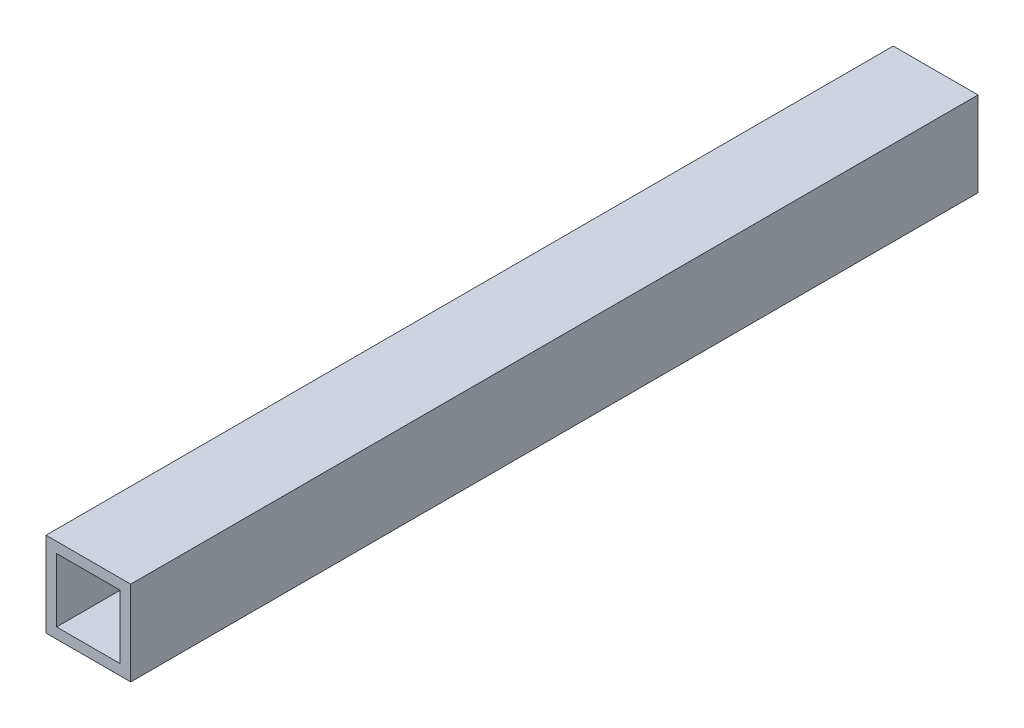
ISO-10303-21;
HEADER;
FILE_DESCRIPTION(('STEP AP214'),'2;1');
FILE_NAME('part.step','',(''),(''),'','','');
FILE_SCHEMA(('AUTOMOTIVE_DESIGN { 1 0 10303 214 1 1 1 1 }'));
ENDSEC;
DATA;
#1=APPLICATION_CONTEXT('core data for automotive mechanical design processes');
#2=APPLICATION_PROTOCOL_DEFINITION('international standard','automotive_design',2000,#1);
#3=PRODUCT_CONTEXT('',#1,'mechanical');
#4=PRODUCT('Part','Part','',(#3));
#5=PRODUCT_RELATED_PRODUCT_CATEGORY('part','',(#4));
#6=PRODUCT_DEFINITION_FORMATION('','',#4);
#7=PRODUCT_DEFINITION_CONTEXT('part definition',#1,'design');
#8=PRODUCT_DEFINITION('design','',#6,#7);
#9=PRODUCT_DEFINITION_SHAPE('','',#8);
#10=(LENGTH_UNIT() NAMED_UNIT(*) SI_UNIT(.MILLI.,.METRE.));
#11=(NAMED_UNIT(*) PLANE_ANGLE_UNIT() SI_UNIT($,.RADIAN.));
#12=(NAMED_UNIT(*) SI_UNIT($,.STERADIAN.) SOLID_ANGLE_UNIT());
#13=UNCERTAINTY_MEASURE_WITH_UNIT(LENGTH_MEASURE(1.E-05),#10,'distance_accuracy_value','');
#14=(GEOMETRIC_REPRESENTATION_CONTEXT(3) GLOBAL_UNCERTAINTY_ASSIGNED_CONTEXT((#13)) GLOBAL_UNIT_ASSIGNED_CONTEXT((#10,
#11,#12)) REPRESENTATION_CONTEXT('',''));
#15=CARTESIAN_POINT('',(0.,0.,0.));
#16=DIRECTION('',(0.,0.,1.));
#17=DIRECTION('',(1.,0.,0.));
#18=AXIS2_PLACEMENT_3D('',#15,#16,#17);
#19=CARTESIAN_POINT('',(0.,0.,254.));
#20=DIRECTION('',(0.,0.,1.));
#21=DIRECTION('',(1.,0.,0.));
#22=AXIS2_PLACEMENT_3D('',#19,#20,#21);
#23=PLANE('',#22);
#24=DIRECTION('',(0.,-1.,0.));
#25=VECTOR('',#24,1.);
#26=CARTESIAN_POINT('',(0.,0.,254.));
#27=LINE('',#26,#25);
#28=CARTESIAN_POINT('',(0.,0.,254.));
#29=VERTEX_POINT('',#28);
#30=CARTESIAN_POINT('',(0.,-25.4,254.));
#31=VERTEX_POINT('',#30);
#32=EDGE_CURVE('E134',#29,#31,#27,.T.);
#33=ORIENTED_EDGE('',*,*,#32,.T.);
#34=DIRECTION('',(1.,0.,0.));
#35=VECTOR('',#34,1.);
#36=CARTESIAN_POINT('',(0.,-25.4,254.));
#37=LINE('',#36,#35);
#38=CARTESIAN_POINT('',(25.4,-25.4,254.));
#39=VERTEX_POINT('',#38);
#40=EDGE_CURVE('E137',#31,#39,#37,.T.);
#41=ORIENTED_EDGE('',*,*,#40,.T.);
#42=DIRECTION('',(0.,1.,0.));
#43=VECTOR('',#42,1.);
#44=CARTESIAN_POINT('',(25.4,0.,254.));
#45=LINE('',#44,#43);
#46=CARTESIAN_POINT('',(25.4,0.,254.));
#47=VERTEX_POINT('',#46);
#48=EDGE_CURVE('E140',#39,#47,#45,.T.);
#49=ORIENTED_EDGE('',*,*,#48,.T.);
#50=DIRECTION('',(-1.,0.,0.));
#51=VECTOR('',#50,1.);
#52=CARTESIAN_POINT('',(0.,0.,254.));
#53=LINE('',#52,#51);
#54=EDGE_CURVE('E142',#47,#29,#53,.T.);
#55=ORIENTED_EDGE('',*,*,#54,.T.);
#56=EDGE_LOOP('',(#33,#41,#49,#55));
#57=FACE_BOUND('',#56,.T.);
#58=DIRECTION('',(1.,0.,0.));
#59=VECTOR('',#58,1.);
#60=CARTESIAN_POINT('',(3.175,-22.225,254.));
#61=LINE('',#60,#59);
#62=CARTESIAN_POINT('',(3.175,-22.225,254.));
#63=VERTEX_POINT('',#62);
#64=CARTESIAN_POINT('',(22.225,-22.225,254.));
#65=VERTEX_POINT('',#64);
#66=EDGE_CURVE('E106',#63,#65,#61,.T.);
#67=ORIENTED_EDGE('',*,*,#66,.F.);
#68=DIRECTION('',(0.,-1.,0.));
#69=VECTOR('',#68,1.);
#70=CARTESIAN_POINT('',(3.175,-3.175,254.));
#71=LINE('',#70,#69);
#72=CARTESIAN_POINT('',(3.175,-3.175,254.));
#73=VERTEX_POINT('',#72);
#74=EDGE_CURVE('E98',#73,#63,#71,.T.);
#75=ORIENTED_EDGE('',*,*,#74,.F.);
#76=DIRECTION('',(-1.,0.,0.));
#77=VECTOR('',#76,1.);
#78=CARTESIAN_POINT('',(3.175,-3.175,254.));
#79=LINE('',#78,#77);
#80=CARTESIAN_POINT('',(22.225,-3.175,254.));
#81=VERTEX_POINT('',#80);
#82=EDGE_CURVE('E120',#81,#73,#79,.T.);
#83=ORIENTED_EDGE('',*,*,#82,.F.);
#84=DIRECTION('',(0.,1.,0.));
#85=VECTOR('',#84,1.);
#86=CARTESIAN_POINT('',(22.225,-3.175,254.));
#87=LINE('',#86,#85);
#88=EDGE_CURVE('E118',#65,#81,#87,.T.);
#89=ORIENTED_EDGE('',*,*,#88,.F.);
#90=EDGE_LOOP('',(#67,#75,#83,#89));
#91=FACE_BOUND('',#90,.T.);
#92=ADVANCED_FACE('F33',(#57,#91),#23,.T.);
#93=CARTESIAN_POINT('',(0.,0.,0.));
#94=DIRECTION('',(0.,0.,1.));
#95=DIRECTION('',(1.,0.,0.));
#96=AXIS2_PLACEMENT_3D('',#93,#94,#95);
#97=PLANE('',#96);
#98=DIRECTION('',(0.,-1.,0.));
#99=VECTOR('',#98,1.);
#100=CARTESIAN_POINT('',(0.,0.,0.));
#101=LINE('',#100,#99);
#102=CARTESIAN_POINT('',(0.,0.,0.));
#103=VERTEX_POINT('',#102);
#104=CARTESIAN_POINT('',(0.,-25.4,0.));
#105=VERTEX_POINT('',#104);
#106=EDGE_CURVE('E114',#103,#105,#101,.T.);
#107=ORIENTED_EDGE('',*,*,#106,.F.);
#108=DIRECTION('',(-1.,0.,0.));
#109=VECTOR('',#108,1.);
#110=CARTESIAN_POINT('',(0.,0.,0.));
#111=LINE('',#110,#109);
#112=CARTESIAN_POINT('',(25.4,0.,0.));
#113=VERTEX_POINT('',#112);
#114=EDGE_CURVE('E138',#113,#103,#111,.T.);
#115=ORIENTED_EDGE('',*,*,#114,.F.);
#116=DIRECTION('',(0.,1.,0.));
#117=VECTOR('',#116,1.);
#118=CARTESIAN_POINT('',(25.4,0.,0.));
#119=LINE('',#118,#117);
#120=CARTESIAN_POINT('',(25.4,-25.4,0.));
#121=VERTEX_POINT('',#120);
#122=EDGE_CURVE('E149',#121,#113,#119,.T.);
#123=ORIENTED_EDGE('',*,*,#122,.F.);
#124=DIRECTION('',(1.,0.,0.));
#125=VECTOR('',#124,1.);
#126=CARTESIAN_POINT('',(0.,-25.4,0.));
#127=LINE('',#126,#125);
#128=EDGE_CURVE('E147',#105,#121,#127,.T.);
#129=ORIENTED_EDGE('',*,*,#128,.F.);
#130=EDGE_LOOP('',(#107,#115,#123,#129));
#131=FACE_BOUND('',#130,.T.);
#132=DIRECTION('',(0.,-1.,0.));
#133=VECTOR('',#132,1.);
#134=CARTESIAN_POINT('',(3.175,-3.175,0.));
#135=LINE('',#134,#133);
#136=CARTESIAN_POINT('',(3.175,-3.175,0.));
#137=VERTEX_POINT('',#136);
#138=CARTESIAN_POINT('',(3.175,-22.225,0.));
#139=VERTEX_POINT('',#138);
#140=EDGE_CURVE('E56',#137,#139,#135,.T.);
#141=ORIENTED_EDGE('',*,*,#140,.T.);
#142=DIRECTION('',(1.,0.,0.));
#143=VECTOR('',#142,1.);
#144=CARTESIAN_POINT('',(3.175,-22.225,0.));
#145=LINE('',#144,#143);
#146=CARTESIAN_POINT('',(22.225,-22.225,0.));
#147=VERTEX_POINT('',#146);
#148=EDGE_CURVE('E113',#139,#147,#145,.T.);
#149=ORIENTED_EDGE('',*,*,#148,.T.);
#150=DIRECTION('',(0.,1.,0.));
#151=VECTOR('',#150,1.);
#152=CARTESIAN_POINT('',(22.225,-3.175,0.));
#153=LINE('',#152,#151);
#154=CARTESIAN_POINT('',(22.225,-3.175,0.));
#155=VERTEX_POINT('',#154);
#156=EDGE_CURVE('E126',#147,#155,#153,.T.);
#157=ORIENTED_EDGE('',*,*,#156,.T.);
#158=DIRECTION('',(-1.,0.,0.));
#159=VECTOR('',#158,1.);
#160=CARTESIAN_POINT('',(3.175,-3.175,0.));
#161=LINE('',#160,#159);
#162=EDGE_CURVE('E107',#155,#137,#161,.T.);
#163=ORIENTED_EDGE('',*,*,#162,.T.);
#164=EDGE_LOOP('',(#141,#149,#157,#163));
#165=FACE_BOUND('',#164,.T.);
#166=ADVANCED_FACE('F167',(#131,#165),#97,.F.);
#167=CARTESIAN_POINT('',(0.,0.,254.));
#168=DIRECTION('',(1.,0.,0.));
#169=DIRECTION('',(0.,1.,0.));
#170=AXIS2_PLACEMENT_3D('',#167,#168,#169);
#171=PLANE('',#170);
#172=ORIENTED_EDGE('',*,*,#106,.T.);
#173=DIRECTION('',(0.,0.,-1.));
#174=VECTOR('',#173,1.);
#175=CARTESIAN_POINT('',(0.,-25.4,254.));
#176=LINE('',#175,#174);
#177=EDGE_CURVE('E11',#31,#105,#176,.T.);
#178=ORIENTED_EDGE('',*,*,#177,.F.);
#179=ORIENTED_EDGE('',*,*,#32,.F.);
#180=DIRECTION('',(0.,0.,-1.));
#181=VECTOR('',#180,1.);
#182=CARTESIAN_POINT('',(0.,0.,254.));
#183=LINE('',#182,#181);
#184=EDGE_CURVE('E144',#29,#103,#183,.T.);
#185=ORIENTED_EDGE('',*,*,#184,.T.);
#186=EDGE_LOOP('',(#172,#178,#179,#185));
#187=FACE_BOUND('',#186,.T.);
#188=ADVANCED_FACE('F35',(#187),#171,.F.);
#189=CARTESIAN_POINT('',(0.,-25.4,254.));
#190=DIRECTION('',(0.,1.,0.));
#191=DIRECTION('',(0.,0.,1.));
#192=AXIS2_PLACEMENT_3D('',#189,#190,#191);
#193=PLANE('',#192);
#194=ORIENTED_EDGE('',*,*,#128,.T.);
#195=DIRECTION('',(0.,0.,-1.));
#196=VECTOR('',#195,1.);
#197=CARTESIAN_POINT('',(25.4,-25.4,254.));
#198=LINE('',#197,#196);
#199=EDGE_CURVE('E41',#39,#121,#198,.T.);
#200=ORIENTED_EDGE('',*,*,#199,.F.);
#201=ORIENTED_EDGE('',*,*,#40,.F.);
#202=ORIENTED_EDGE('',*,*,#177,.T.);
#203=EDGE_LOOP('',(#194,#200,#201,#202));
#204=FACE_BOUND('',#203,.T.);
#205=ADVANCED_FACE('F177',(#204),#193,.F.);
#206=CARTESIAN_POINT('',(25.4,0.,254.));
#207=DIRECTION('',(-1.,0.,0.));
#208=DIRECTION('',(0.,-1.,0.));
#209=AXIS2_PLACEMENT_3D('',#206,#207,#208);
#210=PLANE('',#209);
#211=ORIENTED_EDGE('',*,*,#122,.T.);
#212=DIRECTION('',(0.,0.,-1.));
#213=VECTOR('',#212,1.);
#214=CARTESIAN_POINT('',(25.4,0.,254.));
#215=LINE('',#214,#213);
#216=EDGE_CURVE('E154',#47,#113,#215,.T.);
#217=ORIENTED_EDGE('',*,*,#216,.F.);
#218=ORIENTED_EDGE('',*,*,#48,.F.);
#219=ORIENTED_EDGE('',*,*,#199,.T.);
#220=EDGE_LOOP('',(#211,#217,#218,#219));
#221=FACE_BOUND('',#220,.T.);
#222=ADVANCED_FACE('F161',(#221),#210,.F.);
#223=CARTESIAN_POINT('',(0.,0.,254.));
#224=DIRECTION('',(0.,-1.,0.));
#225=DIRECTION('',(0.,0.,-1.));
#226=AXIS2_PLACEMENT_3D('',#223,#224,#225);
#227=PLANE('',#226);
#228=ORIENTED_EDGE('',*,*,#114,.T.);
#229=ORIENTED_EDGE('',*,*,#184,.F.);
#230=ORIENTED_EDGE('',*,*,#54,.F.);
#231=ORIENTED_EDGE('',*,*,#216,.T.);
#232=EDGE_LOOP('',(#228,#229,#230,#231));
#233=FACE_BOUND('',#232,.T.);
#234=ADVANCED_FACE('F171',(#233),#227,.F.);
#235=CARTESIAN_POINT('',(3.175,-3.175,254.));
#236=DIRECTION('',(1.,0.,0.));
#237=DIRECTION('',(0.,1.,0.));
#238=AXIS2_PLACEMENT_3D('',#235,#236,#237);
#239=PLANE('',#238);
#240=ORIENTED_EDGE('',*,*,#140,.F.);
#241=DIRECTION('',(0.,0.,-1.));
#242=VECTOR('',#241,1.);
#243=CARTESIAN_POINT('',(3.175,-3.175,254.));
#244=LINE('',#243,#242);
#245=EDGE_CURVE('E102',#73,#137,#244,.T.);
#246=ORIENTED_EDGE('',*,*,#245,.F.);
#247=ORIENTED_EDGE('',*,*,#74,.T.);
#248=DIRECTION('',(0.,0.,-1.));
#249=VECTOR('',#248,1.);
#250=CARTESIAN_POINT('',(3.175,-22.225,254.));
#251=LINE('',#250,#249);
#252=EDGE_CURVE('E101',#63,#139,#251,.T.);
#253=ORIENTED_EDGE('',*,*,#252,.T.);
#254=EDGE_LOOP('',(#240,#246,#247,#253));
#255=FACE_BOUND('',#254,.T.);
#256=ADVANCED_FACE('F100',(#255),#239,.T.);
#257=CARTESIAN_POINT('',(3.175,-22.225,254.));
#258=DIRECTION('',(0.,1.,0.));
#259=DIRECTION('',(0.,0.,1.));
#260=AXIS2_PLACEMENT_3D('',#257,#258,#259);
#261=PLANE('',#260);
#262=ORIENTED_EDGE('',*,*,#148,.F.);
#263=ORIENTED_EDGE('',*,*,#252,.F.);
#264=ORIENTED_EDGE('',*,*,#66,.T.);
#265=DIRECTION('',(0.,0.,-1.));
#266=VECTOR('',#265,1.);
#267=CARTESIAN_POINT('',(22.225,-22.225,254.));
#268=LINE('',#267,#266);
#269=EDGE_CURVE('E115',#65,#147,#268,.T.);
#270=ORIENTED_EDGE('',*,*,#269,.T.);
#271=EDGE_LOOP('',(#262,#263,#264,#270));
#272=FACE_BOUND('',#271,.T.);
#273=ADVANCED_FACE('F110',(#272),#261,.T.);
#274=CARTESIAN_POINT('',(22.225,-3.175,254.));
#275=DIRECTION('',(-1.,0.,0.));
#276=DIRECTION('',(0.,0.,1.));
#277=AXIS2_PLACEMENT_3D('',#274,#275,#276);
#278=PLANE('',#277);
#279=ORIENTED_EDGE('',*,*,#156,.F.);
#280=ORIENTED_EDGE('',*,*,#269,.F.);
#281=ORIENTED_EDGE('',*,*,#88,.T.);
#282=DIRECTION('',(0.,0.,-1.));
#283=VECTOR('',#282,1.);
#284=CARTESIAN_POINT('',(22.225,-3.175,254.));
#285=LINE('',#284,#283);
#286=EDGE_CURVE('E48',#81,#155,#285,.T.);
#287=ORIENTED_EDGE('',*,*,#286,.T.);
#288=EDGE_LOOP('',(#279,#280,#281,#287));
#289=FACE_BOUND('',#288,.T.);
#290=ADVANCED_FACE('F200',(#289),#278,.T.);
#291=CARTESIAN_POINT('',(3.175,-3.175,254.));
#292=DIRECTION('',(0.,-1.,0.));
#293=DIRECTION('',(0.,0.,-1.));
#294=AXIS2_PLACEMENT_3D('',#291,#292,#293);
#295=PLANE('',#294);
#296=ORIENTED_EDGE('',*,*,#162,.F.);
#297=ORIENTED_EDGE('',*,*,#286,.F.);
#298=ORIENTED_EDGE('',*,*,#82,.T.);
#299=ORIENTED_EDGE('',*,*,#245,.T.);
#300=EDGE_LOOP('',(#296,#297,#298,#299));
#301=FACE_BOUND('',#300,.T.);
#302=ADVANCED_FACE('F204',(#301),#295,.T.);
#303=CLOSED_SHELL('',(#92,#166,#188,#205,#222,#234,#256,#273,#290,#302));
#304=MANIFOLD_SOLID_BREP('B2',#303);
#305=ADVANCED_BREP_SHAPE_REPRESENTATION('',(#18,#304),#14);
#306=SHAPE_DEFINITION_REPRESENTATION(#9,#305);
ENDSEC;
END-ISO-10303-21;
